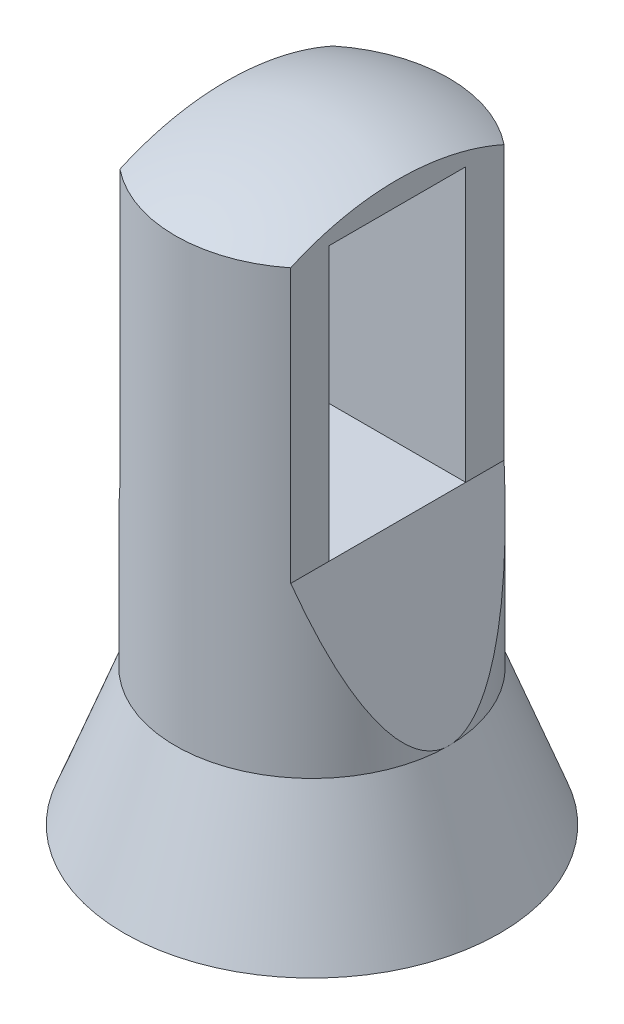
ISO-10303-21;
HEADER;
FILE_DESCRIPTION(('STEP AP214'),'2;1');
FILE_NAME('part.step','',(''),(''),'','','');
FILE_SCHEMA(('AUTOMOTIVE_DESIGN { 1 0 10303 214 1 1 1 1 }'));
ENDSEC;
DATA;
#1=APPLICATION_CONTEXT('core data for automotive mechanical design processes');
#2=APPLICATION_PROTOCOL_DEFINITION('international standard','automotive_design',2000,#1);
#3=PRODUCT_CONTEXT('',#1,'mechanical');
#4=PRODUCT('Part','Part','',(#3));
#5=PRODUCT_RELATED_PRODUCT_CATEGORY('part','',(#4));
#6=PRODUCT_DEFINITION_FORMATION('','',#4);
#7=PRODUCT_DEFINITION_CONTEXT('part definition',#1,'design');
#8=PRODUCT_DEFINITION('design','',#6,#7);
#9=PRODUCT_DEFINITION_SHAPE('','',#8);
#10=(LENGTH_UNIT() NAMED_UNIT(*) SI_UNIT(.MILLI.,.METRE.));
#11=(NAMED_UNIT(*) PLANE_ANGLE_UNIT() SI_UNIT($,.RADIAN.));
#12=(NAMED_UNIT(*) SI_UNIT($,.STERADIAN.) SOLID_ANGLE_UNIT());
#13=UNCERTAINTY_MEASURE_WITH_UNIT(LENGTH_MEASURE(1.E-05),#10,'distance_accuracy_value','');
#14=(GEOMETRIC_REPRESENTATION_CONTEXT(3) GLOBAL_UNCERTAINTY_ASSIGNED_CONTEXT((#13)) GLOBAL_UNIT_ASSIGNED_CONTEXT((#10,
#11,#12)) REPRESENTATION_CONTEXT('',''));
#15=CARTESIAN_POINT('',(0.,0.,0.));
#16=DIRECTION('',(0.,0.,1.));
#17=DIRECTION('',(1.,0.,0.));
#18=AXIS2_PLACEMENT_3D('',#15,#16,#17);
#19=CARTESIAN_POINT('',(0.,114.3,0.));
#20=DIRECTION('',(0.,1.,0.));
#21=DIRECTION('',(0.,0.,1.));
#22=AXIS2_PLACEMENT_3D('',#19,#20,#21);
#23=CYLINDRICAL_SURFACE('',#22,25.4);
#24=DIRECTION('',(0.,1.,0.));
#25=VECTOR('',#24,1.);
#26=CARTESIAN_POINT('',(-15.8749999999941,114.3,19.8278686449197));
#27=LINE('',#26,#25);
#28=CARTESIAN_POINT('',(-15.8749999999515,56.6940905123943,19.8278686449686));
#29=VERTEX_POINT('',#28);
#30=CARTESIAN_POINT('',(-15.8749999999941,107.494090512249,19.8278686449197));
#31=VERTEX_POINT('',#30);
#32=EDGE_CURVE('E148',#29,#31,#27,.T.);
#33=ORIENTED_EDGE('',*,*,#32,.F.);
#34=CARTESIAN_POINT('',(0.,108.850908032584,0.));
#35=DIRECTION('',(-0.956667820920056,0.291181524853606,0.));
#36=DIRECTION('',(0.291181524853606,0.956667820920057,0.));
#37=AXIS2_PLACEMENT_3D('',#34,#35,#36);
#38=ELLIPSE('',#37,87.2308090726914,25.4);
#39=CARTESIAN_POINT('',(-25.4,25.3999999999852,0.));
#40=VERTEX_POINT('',#39);
#41=EDGE_CURVE('E167',#40,#29,#38,.T.);
#42=ORIENTED_EDGE('',*,*,#41,.F.);
#43=CARTESIAN_POINT('',(0.,25.4,0.));
#44=DIRECTION('',(0.,1.,0.));
#45=DIRECTION('',(0.,0.,1.));
#46=AXIS2_PLACEMENT_3D('',#43,#44,#45);
#47=CIRCLE('',#46,25.4);
#48=CARTESIAN_POINT('',(25.4,25.4000000000556,0.));
#49=VERTEX_POINT('',#48);
#50=EDGE_CURVE('E158',#40,#49,#47,.T.);
#51=ORIENTED_EDGE('',*,*,#50,.T.);
#52=CARTESIAN_POINT('',(0.,108.850908032926,0.));
#53=DIRECTION('',(0.956667820920056,0.291181524853606,0.));
#54=DIRECTION('',(-0.291181524853606,0.956667820920057,0.));
#55=AXIS2_PLACEMENT_3D('',#52,#53,#54);
#56=ELLIPSE('',#55,87.2308090726914,25.4);
#57=CARTESIAN_POINT('',(15.8749999999941,56.6940905123374,19.8278686449197));
#58=VERTEX_POINT('',#57);
#59=EDGE_CURVE('E165',#58,#49,#56,.T.);
#60=ORIENTED_EDGE('',*,*,#59,.F.);
#61=DIRECTION('',(0.,1.,0.));
#62=VECTOR('',#61,1.);
#63=CARTESIAN_POINT('',(15.8749999999941,114.3,19.8278686449197));
#64=LINE('',#63,#62);
#65=CARTESIAN_POINT('',(15.8749999999941,107.494090512249,19.8278686449197));
#66=VERTEX_POINT('',#65);
#67=EDGE_CURVE('E141',#66,#58,#64,.F.);
#68=ORIENTED_EDGE('',*,*,#67,.F.);
#69=CARTESIAN_POINT('',(0.,107.494090512249,0.));
#70=DIRECTION('',(0.,1.,0.));
#71=DIRECTION('',(0.,0.,1.));
#72=AXIS2_PLACEMENT_3D('',#69,#70,#71);
#73=CIRCLE('',#72,25.4);
#74=EDGE_CURVE('E150',#31,#66,#73,.T.);
#75=ORIENTED_EDGE('',*,*,#74,.F.);
#76=EDGE_LOOP('',(#33,#42,#51,#60,#68,#75));
#77=FACE_BOUND('',#76,.T.);
#78=ADVANCED_FACE('F33',(#77),#23,.T.);
#79=DIRECTION('',(0.,1.,0.));
#80=VECTOR('',#79,1.);
#81=CARTESIAN_POINT('',(-15.8749999999941,114.3,-19.8278686449197));
#82=LINE('',#81,#80);
#83=CARTESIAN_POINT('',(-15.8749999999941,107.494090512249,-19.8278686449197));
#84=VERTEX_POINT('',#83);
#85=CARTESIAN_POINT('',(-15.8749999999515,56.6940905123943,-19.8278686449686));
#86=VERTEX_POINT('',#85);
#87=EDGE_CURVE('E146',#84,#86,#82,.F.);
#88=ORIENTED_EDGE('',*,*,#87,.F.);
#89=CARTESIAN_POINT('',(15.8749999999941,107.494090512249,-19.8278686449197));
#90=VERTEX_POINT('',#89);
#91=EDGE_CURVE('E153',#90,#84,#73,.T.);
#92=ORIENTED_EDGE('',*,*,#91,.F.);
#93=DIRECTION('',(0.,1.,0.));
#94=VECTOR('',#93,1.);
#95=CARTESIAN_POINT('',(15.8749999999941,114.3,-19.8278686449197));
#96=LINE('',#95,#94);
#97=CARTESIAN_POINT('',(15.8749999999941,56.6940905123374,-19.8278686449197));
#98=VERTEX_POINT('',#97);
#99=EDGE_CURVE('E144',#98,#90,#96,.T.);
#100=ORIENTED_EDGE('',*,*,#99,.F.);
#101=EDGE_CURVE('E131',#49,#98,#56,.T.);
#102=ORIENTED_EDGE('',*,*,#101,.F.);
#103=EDGE_CURVE('E154',#49,#40,#47,.T.);
#104=ORIENTED_EDGE('',*,*,#103,.T.);
#105=EDGE_CURVE('E170',#86,#40,#38,.T.);
#106=ORIENTED_EDGE('',*,*,#105,.F.);
#107=EDGE_LOOP('',(#88,#92,#100,#102,#104,#106));
#108=FACE_BOUND('',#107,.T.);
#109=ADVANCED_FACE('F206',(#108),#23,.T.);
#110=CARTESIAN_POINT('',(0.,63.5,0.));
#111=DIRECTION('',(0.,1.,0.));
#112=DIRECTION('',(1.,0.,0.));
#113=AXIS2_PLACEMENT_3D('',#110,#111,#112);
#114=SPHERICAL_SURFACE('',#113,50.8);
#115=CARTESIAN_POINT('',(-15.8749999999941,63.5,0.));
#116=DIRECTION('',(-1.,0.,0.));
#117=DIRECTION('',(0.,0.,1.));
#118=AXIS2_PLACEMENT_3D('',#115,#116,#117);
#119=CIRCLE('',#118,48.2558221875888);
#120=EDGE_CURVE('E163',#31,#84,#119,.T.);
#121=ORIENTED_EDGE('',*,*,#120,.F.);
#122=ORIENTED_EDGE('',*,*,#74,.T.);
#123=CARTESIAN_POINT('',(15.8749999999941,63.5,0.));
#124=DIRECTION('',(1.,0.,0.));
#125=DIRECTION('',(0.,0.,-1.));
#126=AXIS2_PLACEMENT_3D('',#123,#124,#125);
#127=CIRCLE('',#126,48.2558221875888);
#128=EDGE_CURVE('E161',#90,#66,#127,.T.);
#129=ORIENTED_EDGE('',*,*,#128,.F.);
#130=ORIENTED_EDGE('',*,*,#91,.T.);
#131=EDGE_LOOP('',(#121,#122,#129,#130));
#132=FACE_BOUND('',#131,.T.);
#133=ADVANCED_FACE('F197',(#132),#114,.T.);
#134=CARTESIAN_POINT('',(0.,0.,0.));
#135=DIRECTION('',(0.,1.,0.));
#136=DIRECTION('',(0.,0.,1.));
#137=AXIS2_PLACEMENT_3D('',#134,#135,#136);
#138=PLANE('',#137);
#139=CARTESIAN_POINT('',(0.,0.,0.));
#140=DIRECTION('',(0.,1.,0.));
#141=DIRECTION('',(0.,0.,1.));
#142=AXIS2_PLACEMENT_3D('',#139,#140,#141);
#143=CIRCLE('',#142,34.925);
#144=CARTESIAN_POINT('',(0.,0.,34.925));
#145=VERTEX_POINT('',#144);
#146=EDGE_CURVE('E157',#145,#145,#143,.T.);
#147=ORIENTED_EDGE('',*,*,#146,.F.);
#148=EDGE_LOOP('',(#147));
#149=FACE_BOUND('',#148,.T.);
#150=ADVANCED_FACE('F35',(#149),#138,.F.);
#151=CARTESIAN_POINT('',(0.,0.,0.));
#152=DIRECTION('',(0.,-1.,0.));
#153=DIRECTION('',(0.,0.,-1.));
#154=AXIS2_PLACEMENT_3D('',#151,#152,#153);
#155=CONICAL_SURFACE('',#154,34.925,0.358770670270572);
#156=ORIENTED_EDGE('',*,*,#103,.F.);
#157=ORIENTED_EDGE('',*,*,#50,.F.);
#158=EDGE_LOOP('',(#156,#157));
#159=FACE_BOUND('',#158,.T.);
#160=ORIENTED_EDGE('',*,*,#146,.T.);
#161=EDGE_LOOP('',(#160));
#162=FACE_BOUND('',#161,.T.);
#163=ADVANCED_FACE('F204',(#159,#162),#155,.T.);
#164=CARTESIAN_POINT('',(47308.9394078057,-155323.194432271,-34.925));
#165=DIRECTION('',(0.956667820920056,0.291181524853606,0.));
#166=DIRECTION('',(-0.291181524853606,0.956667820920057,0.));
#167=AXIS2_PLACEMENT_3D('',#164,#165,#166);
#168=PLANE('',#167);
#169=ORIENTED_EDGE('',*,*,#59,.T.);
#170=ORIENTED_EDGE('',*,*,#101,.T.);
#171=DIRECTION('',(0.,0.,1.));
#172=VECTOR('',#171,1.);
#173=CARTESIAN_POINT('',(15.8749999999941,56.6940905123374,-34.925));
#174=LINE('',#173,#172);
#175=CARTESIAN_POINT('',(15.8749999999941,56.6940905123374,-12.7));
#176=VERTEX_POINT('',#175);
#177=EDGE_CURVE('E124',#98,#176,#174,.T.);
#178=ORIENTED_EDGE('',*,*,#177,.T.);
#179=DIRECTION('',(0.,0.,-1.));
#180=VECTOR('',#179,1.);
#181=CARTESIAN_POINT('',(15.8749999999941,56.6940905123374,12.7));
#182=LINE('',#181,#180);
#183=CARTESIAN_POINT('',(15.8749999999941,56.6940905123374,12.7));
#184=VERTEX_POINT('',#183);
#185=EDGE_CURVE('E115',#184,#176,#182,.T.);
#186=ORIENTED_EDGE('',*,*,#185,.F.);
#187=EDGE_CURVE('E133',#184,#58,#174,.T.);
#188=ORIENTED_EDGE('',*,*,#187,.T.);
#189=EDGE_LOOP('',(#169,#170,#178,#186,#188));
#190=FACE_BOUND('',#189,.T.);
#191=ADVANCED_FACE('F129',(#190),#168,.T.);
#192=CARTESIAN_POINT('',(15.8749999999941,-291474.734407257,-34.925));
#193=DIRECTION('',(1.,0.,0.));
#194=DIRECTION('',(0.,0.,-1.));
#195=AXIS2_PLACEMENT_3D('',#192,#193,#194);
#196=PLANE('',#195);
#197=DIRECTION('',(0.,-1.,0.));
#198=VECTOR('',#197,1.);
#199=CARTESIAN_POINT('',(15.8749999999941,56.6940905123374,12.7));
#200=LINE('',#199,#198);
#201=CARTESIAN_POINT('',(15.8749999999941,107.494090512337,12.7));
#202=VERTEX_POINT('',#201);
#203=EDGE_CURVE('E48',#202,#184,#200,.T.);
#204=ORIENTED_EDGE('',*,*,#203,.F.);
#205=DIRECTION('',(0.,0.,1.));
#206=VECTOR('',#205,1.);
#207=CARTESIAN_POINT('',(15.8749999999941,107.494090512337,12.7));
#208=LINE('',#207,#206);
#209=CARTESIAN_POINT('',(15.8749999999941,107.494090512337,-12.7));
#210=VERTEX_POINT('',#209);
#211=EDGE_CURVE('E127',#210,#202,#208,.T.);
#212=ORIENTED_EDGE('',*,*,#211,.F.);
#213=DIRECTION('',(0.,1.,0.));
#214=VECTOR('',#213,1.);
#215=CARTESIAN_POINT('',(15.8749999999941,56.6940905123374,-12.7));
#216=LINE('',#215,#214);
#217=EDGE_CURVE('E106',#176,#210,#216,.T.);
#218=ORIENTED_EDGE('',*,*,#217,.F.);
#219=ORIENTED_EDGE('',*,*,#177,.F.);
#220=ORIENTED_EDGE('',*,*,#99,.T.);
#221=ORIENTED_EDGE('',*,*,#128,.T.);
#222=ORIENTED_EDGE('',*,*,#67,.T.);
#223=ORIENTED_EDGE('',*,*,#187,.F.);
#224=EDGE_LOOP('',(#204,#212,#218,#219,#220,#221,#222,#223));
#225=FACE_BOUND('',#224,.T.);
#226=ADVANCED_FACE('F123',(#225),#196,.T.);
#227=CARTESIAN_POINT('',(-115140.437322345,-378181.465856843,-34.925));
#228=DIRECTION('',(-0.956667820920056,0.291181524853606,0.));
#229=DIRECTION('',(-0.291181524853606,-0.956667820920057,0.));
#230=AXIS2_PLACEMENT_3D('',#227,#228,#229);
#231=PLANE('',#230);
#232=ORIENTED_EDGE('',*,*,#105,.T.);
#233=ORIENTED_EDGE('',*,*,#41,.T.);
#234=DIRECTION('',(0.,0.,1.));
#235=VECTOR('',#234,1.);
#236=CARTESIAN_POINT('',(-15.8749999999515,56.6940905123943,-34.925));
#237=LINE('',#236,#235);
#238=CARTESIAN_POINT('',(-15.8749999999941,56.6940905123374,12.7));
#239=VERTEX_POINT('',#238);
#240=EDGE_CURVE('E132',#239,#29,#237,.T.);
#241=ORIENTED_EDGE('',*,*,#240,.F.);
#242=CARTESIAN_POINT('',(-15.8749999999515,56.6940905123943,-12.7));
#243=VERTEX_POINT('',#242);
#244=EDGE_CURVE('E135',#243,#239,#237,.T.);
#245=ORIENTED_EDGE('',*,*,#244,.F.);
#246=EDGE_CURVE('E137',#86,#243,#237,.T.);
#247=ORIENTED_EDGE('',*,*,#246,.F.);
#248=EDGE_LOOP('',(#232,#233,#241,#245,#247));
#249=FACE_BOUND('',#248,.T.);
#250=ADVANCED_FACE('F186',(#249),#231,.T.);
#251=CARTESIAN_POINT('',(-15.8749999999941,-291474.734407257,-34.925));
#252=DIRECTION('',(-1.,0.,0.));
#253=DIRECTION('',(0.,0.,1.));
#254=AXIS2_PLACEMENT_3D('',#251,#252,#253);
#255=PLANE('',#254);
#256=DIRECTION('',(0.,1.,0.));
#257=VECTOR('',#256,1.);
#258=CARTESIAN_POINT('',(-15.8749999999941,-291474.734407257,12.7));
#259=LINE('',#258,#257);
#260=CARTESIAN_POINT('',(-15.8749999999941,107.494090512337,12.7));
#261=VERTEX_POINT('',#260);
#262=EDGE_CURVE('E11',#239,#261,#259,.T.);
#263=ORIENTED_EDGE('',*,*,#262,.F.);
#264=ORIENTED_EDGE('',*,*,#240,.T.);
#265=ORIENTED_EDGE('',*,*,#32,.T.);
#266=ORIENTED_EDGE('',*,*,#120,.T.);
#267=ORIENTED_EDGE('',*,*,#87,.T.);
#268=ORIENTED_EDGE('',*,*,#246,.T.);
#269=DIRECTION('',(0.,-1.,0.));
#270=VECTOR('',#269,1.);
#271=CARTESIAN_POINT('',(-15.8749999999941,-291474.734407257,-12.7));
#272=LINE('',#271,#270);
#273=CARTESIAN_POINT('',(-15.8749999999941,107.494090512337,-12.7));
#274=VERTEX_POINT('',#273);
#275=EDGE_CURVE('E109',#274,#243,#272,.T.);
#276=ORIENTED_EDGE('',*,*,#275,.F.);
#277=DIRECTION('',(0.,0.,-1.));
#278=VECTOR('',#277,1.);
#279=CARTESIAN_POINT('',(-15.8749999999941,107.494090512319,-34.925));
#280=LINE('',#279,#278);
#281=EDGE_CURVE('E41',#261,#274,#280,.T.);
#282=ORIENTED_EDGE('',*,*,#281,.F.);
#283=EDGE_LOOP('',(#263,#264,#265,#266,#267,#268,#276,#282));
#284=FACE_BOUND('',#283,.T.);
#285=ADVANCED_FACE('F179',(#284),#255,.T.);
#286=CARTESIAN_POINT('',(-238.125000000006,56.6940905123374,12.7));
#287=DIRECTION('',(0.,0.,1.));
#288=DIRECTION('',(1.,0.,0.));
#289=AXIS2_PLACEMENT_3D('',#286,#287,#288);
#290=PLANE('',#289);
#291=ORIENTED_EDGE('',*,*,#262,.T.);
#292=DIRECTION('',(1.,0.,0.));
#293=VECTOR('',#292,1.);
#294=CARTESIAN_POINT('',(-238.125000000006,107.494090512337,12.7));
#295=LINE('',#294,#293);
#296=EDGE_CURVE('E138',#261,#202,#295,.T.);
#297=ORIENTED_EDGE('',*,*,#296,.T.);
#298=ORIENTED_EDGE('',*,*,#203,.T.);
#299=DIRECTION('',(1.,0.,0.));
#300=VECTOR('',#299,1.);
#301=CARTESIAN_POINT('',(-238.125000000006,56.6940905123374,12.7));
#302=LINE('',#301,#300);
#303=EDGE_CURVE('E112',#239,#184,#302,.T.);
#304=ORIENTED_EDGE('',*,*,#303,.F.);
#305=EDGE_LOOP('',(#291,#297,#298,#304));
#306=FACE_BOUND('',#305,.T.);
#307=ADVANCED_FACE('F185',(#306),#290,.F.);
#308=CARTESIAN_POINT('',(-238.125000000006,107.494090512337,12.7));
#309=DIRECTION('',(0.,1.,0.));
#310=DIRECTION('',(0.,0.,1.));
#311=AXIS2_PLACEMENT_3D('',#308,#309,#310);
#312=PLANE('',#311);
#313=ORIENTED_EDGE('',*,*,#281,.T.);
#314=DIRECTION('',(1.,0.,0.));
#315=VECTOR('',#314,1.);
#316=CARTESIAN_POINT('',(-238.125000000006,107.494090512337,-12.7));
#317=LINE('',#316,#315);
#318=EDGE_CURVE('E111',#274,#210,#317,.T.);
#319=ORIENTED_EDGE('',*,*,#318,.T.);
#320=ORIENTED_EDGE('',*,*,#211,.T.);
#321=ORIENTED_EDGE('',*,*,#296,.F.);
#322=EDGE_LOOP('',(#313,#319,#320,#321));
#323=FACE_BOUND('',#322,.T.);
#324=ADVANCED_FACE('F174',(#323),#312,.F.);
#325=CARTESIAN_POINT('',(-238.125000000006,56.6940905123374,-12.7));
#326=DIRECTION('',(0.,0.,-1.));
#327=DIRECTION('',(-1.,0.,0.));
#328=AXIS2_PLACEMENT_3D('',#325,#326,#327);
#329=PLANE('',#328);
#330=ORIENTED_EDGE('',*,*,#275,.T.);
#331=DIRECTION('',(1.,0.,0.));
#332=VECTOR('',#331,1.);
#333=CARTESIAN_POINT('',(-238.125000000006,56.6940905123374,-12.7));
#334=LINE('',#333,#332);
#335=EDGE_CURVE('E56',#243,#176,#334,.T.);
#336=ORIENTED_EDGE('',*,*,#335,.T.);
#337=ORIENTED_EDGE('',*,*,#217,.T.);
#338=ORIENTED_EDGE('',*,*,#318,.F.);
#339=EDGE_LOOP('',(#330,#336,#337,#338));
#340=FACE_BOUND('',#339,.T.);
#341=ADVANCED_FACE('F103',(#340),#329,.F.);
#342=CARTESIAN_POINT('',(-238.125000000006,56.6940905123374,12.7));
#343=DIRECTION('',(0.,-1.,0.));
#344=DIRECTION('',(0.,0.,-1.));
#345=AXIS2_PLACEMENT_3D('',#342,#343,#344);
#346=PLANE('',#345);
#347=ORIENTED_EDGE('',*,*,#244,.T.);
#348=ORIENTED_EDGE('',*,*,#303,.T.);
#349=ORIENTED_EDGE('',*,*,#185,.T.);
#350=ORIENTED_EDGE('',*,*,#335,.F.);
#351=EDGE_LOOP('',(#347,#348,#349,#350));
#352=FACE_BOUND('',#351,.T.);
#353=ADVANCED_FACE('F116',(#352),#346,.F.);
#354=CLOSED_SHELL('',(#78,#109,#133,#150,#163,#191,#226,#250,#285,#307,#324,#341,#353));
#355=MANIFOLD_SOLID_BREP('B2',#354);
#356=ADVANCED_BREP_SHAPE_REPRESENTATION('',(#18,#355),#14);
#357=SHAPE_DEFINITION_REPRESENTATION(#9,#356);
ENDSEC;
END-ISO-10303-21;
